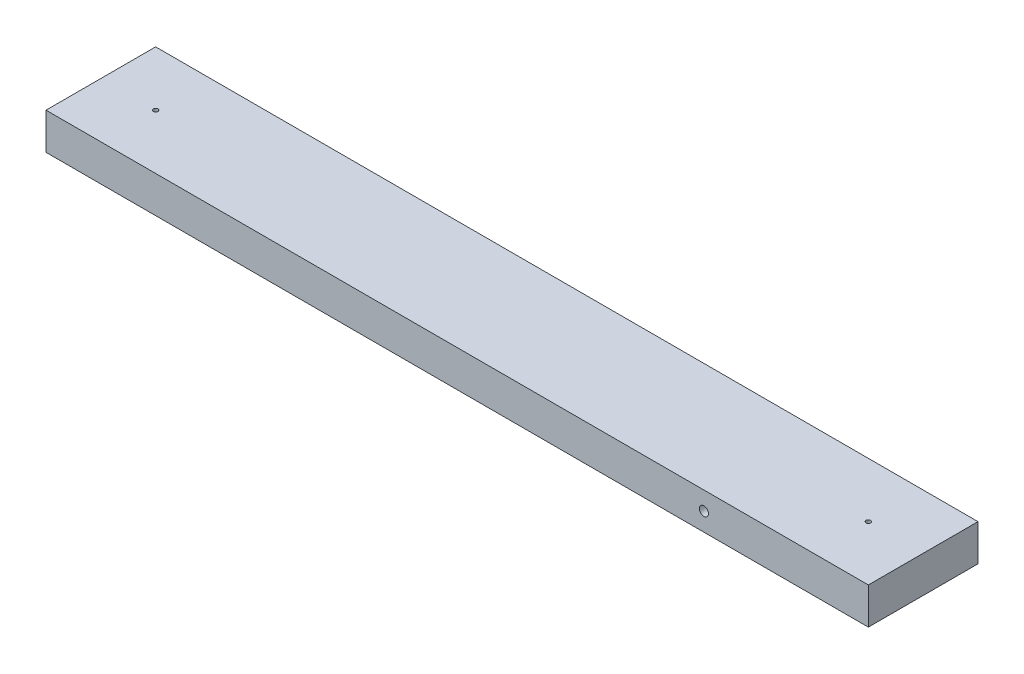
ISO-10303-21;
HEADER;
FILE_DESCRIPTION(('STEP AP214'),'2;1');
FILE_NAME('part.step','',(''),(''),'','','');
FILE_SCHEMA(('AUTOMOTIVE_DESIGN { 1 0 10303 214 1 1 1 1 }'));
ENDSEC;
DATA;
#1=APPLICATION_CONTEXT('core data for automotive mechanical design processes');
#2=APPLICATION_PROTOCOL_DEFINITION('international standard','automotive_design',2000,#1);
#3=PRODUCT_CONTEXT('',#1,'mechanical');
#4=PRODUCT('Part','Part','',(#3));
#5=PRODUCT_RELATED_PRODUCT_CATEGORY('part','',(#4));
#6=PRODUCT_DEFINITION_FORMATION('','',#4);
#7=PRODUCT_DEFINITION_CONTEXT('part definition',#1,'design');
#8=PRODUCT_DEFINITION('design','',#6,#7);
#9=PRODUCT_DEFINITION_SHAPE('','',#8);
#10=(LENGTH_UNIT() NAMED_UNIT(*) SI_UNIT(.MILLI.,.METRE.));
#11=(NAMED_UNIT(*) PLANE_ANGLE_UNIT() SI_UNIT($,.RADIAN.));
#12=(NAMED_UNIT(*) SI_UNIT($,.STERADIAN.) SOLID_ANGLE_UNIT());
#13=UNCERTAINTY_MEASURE_WITH_UNIT(LENGTH_MEASURE(1.E-05),#10,'distance_accuracy_value','');
#14=(GEOMETRIC_REPRESENTATION_CONTEXT(3) GLOBAL_UNCERTAINTY_ASSIGNED_CONTEXT((#13)) GLOBAL_UNIT_ASSIGNED_CONTEXT((#10,
#11,#12)) REPRESENTATION_CONTEXT('',''));
#15=CARTESIAN_POINT('',(0.,0.,0.));
#16=DIRECTION('',(0.,0.,1.));
#17=DIRECTION('',(1.,0.,0.));
#18=AXIS2_PLACEMENT_3D('',#15,#16,#17);
#19=CARTESIAN_POINT('',(2286.,50.8,-152.4));
#20=DIRECTION('',(0.,0.,1.));
#21=DIRECTION('',(1.,0.,0.));
#22=AXIS2_PLACEMENT_3D('',#19,#20,#21);
#23=PLANE('',#22);
#24=CARTESIAN_POINT('',(1828.8,0.,-152.4));
#25=DIRECTION('',(0.,0.,1.));
#26=DIRECTION('',(1.,0.,0.));
#27=AXIS2_PLACEMENT_3D('',#24,#25,#26);
#28=CIRCLE('',#27,12.6999999999999);
#29=CARTESIAN_POINT('',(1841.5,0.,-152.4));
#30=VERTEX_POINT('',#29);
#31=EDGE_CURVE('E104',#30,#30,#28,.F.);
#32=ORIENTED_EDGE('',*,*,#31,.F.);
#33=EDGE_LOOP('',(#32));
#34=FACE_BOUND('',#33,.T.);
#35=DIRECTION('',(0.,1.,0.));
#36=VECTOR('',#35,1.);
#37=CARTESIAN_POINT('',(0.,50.8,-152.4));
#38=LINE('',#37,#36);
#39=CARTESIAN_POINT('',(0.,-50.8,-152.4));
#40=VERTEX_POINT('',#39);
#41=CARTESIAN_POINT('',(0.,50.8,-152.4));
#42=VERTEX_POINT('',#41);
#43=EDGE_CURVE('E101',#40,#42,#38,.T.);
#44=ORIENTED_EDGE('',*,*,#43,.T.);
#45=DIRECTION('',(-1.,0.,0.));
#46=VECTOR('',#45,1.);
#47=CARTESIAN_POINT('',(2286.,50.8,-152.4));
#48=LINE('',#47,#46);
#49=CARTESIAN_POINT('',(2286.,50.8,-152.4));
#50=VERTEX_POINT('',#49);
#51=EDGE_CURVE('E11',#50,#42,#48,.T.);
#52=ORIENTED_EDGE('',*,*,#51,.F.);
#53=DIRECTION('',(0.,1.,0.));
#54=VECTOR('',#53,1.);
#55=CARTESIAN_POINT('',(2286.,50.8,-152.4));
#56=LINE('',#55,#54);
#57=CARTESIAN_POINT('',(2286.,-50.8,-152.4));
#58=VERTEX_POINT('',#57);
#59=EDGE_CURVE('E89',#58,#50,#56,.T.);
#60=ORIENTED_EDGE('',*,*,#59,.F.);
#61=DIRECTION('',(-1.,0.,0.));
#62=VECTOR('',#61,1.);
#63=CARTESIAN_POINT('',(2286.,-50.8,-152.4));
#64=LINE('',#63,#62);
#65=EDGE_CURVE('E97',#58,#40,#64,.T.);
#66=ORIENTED_EDGE('',*,*,#65,.T.);
#67=EDGE_LOOP('',(#44,#52,#60,#66));
#68=FACE_BOUND('',#67,.T.);
#69=ADVANCED_FACE('F38',(#34,#68),#23,.F.);
#70=CARTESIAN_POINT('',(2286.,50.8,152.4));
#71=DIRECTION('',(0.,-1.,0.));
#72=DIRECTION('',(0.,0.,-1.));
#73=AXIS2_PLACEMENT_3D('',#70,#71,#72);
#74=PLANE('',#73);
#75=CARTESIAN_POINT('',(152.4,50.8,0.));
#76=DIRECTION('',(0.,-1.,0.));
#77=DIRECTION('',(0.,0.,-1.));
#78=AXIS2_PLACEMENT_3D('',#75,#76,#77);
#79=CIRCLE('',#78,6.35);
#80=CARTESIAN_POINT('',(152.4,50.8,-6.35));
#81=VERTEX_POINT('',#80);
#82=EDGE_CURVE('E126',#81,#81,#79,.F.);
#83=ORIENTED_EDGE('',*,*,#82,.F.);
#84=EDGE_LOOP('',(#83));
#85=FACE_BOUND('',#84,.T.);
#86=CARTESIAN_POINT('',(2133.6,50.8,0.));
#87=DIRECTION('',(0.,1.,0.));
#88=DIRECTION('',(0.,0.,1.));
#89=AXIS2_PLACEMENT_3D('',#86,#87,#88);
#90=CIRCLE('',#89,6.34999999999972);
#91=CARTESIAN_POINT('',(2133.6,50.8,6.34999999999972));
#92=VERTEX_POINT('',#91);
#93=EDGE_CURVE('E123',#92,#92,#90,.T.);
#94=ORIENTED_EDGE('',*,*,#93,.F.);
#95=EDGE_LOOP('',(#94));
#96=FACE_BOUND('',#95,.T.);
#97=DIRECTION('',(0.,0.,1.));
#98=VECTOR('',#97,1.);
#99=CARTESIAN_POINT('',(0.,50.8,152.4));
#100=LINE('',#99,#98);
#101=CARTESIAN_POINT('',(0.,50.8,152.4));
#102=VERTEX_POINT('',#101);
#103=EDGE_CURVE('E93',#42,#102,#100,.T.);
#104=ORIENTED_EDGE('',*,*,#103,.T.);
#105=DIRECTION('',(-1.,0.,0.));
#106=VECTOR('',#105,1.);
#107=CARTESIAN_POINT('',(2286.,50.8,152.4));
#108=LINE('',#107,#106);
#109=CARTESIAN_POINT('',(2286.,50.8,152.4));
#110=VERTEX_POINT('',#109);
#111=EDGE_CURVE('E46',#110,#102,#108,.T.);
#112=ORIENTED_EDGE('',*,*,#111,.F.);
#113=DIRECTION('',(0.,0.,1.));
#114=VECTOR('',#113,1.);
#115=CARTESIAN_POINT('',(2286.,50.8,152.4));
#116=LINE('',#115,#114);
#117=EDGE_CURVE('E84',#50,#110,#116,.T.);
#118=ORIENTED_EDGE('',*,*,#117,.F.);
#119=ORIENTED_EDGE('',*,*,#51,.T.);
#120=EDGE_LOOP('',(#104,#112,#118,#119));
#121=FACE_BOUND('',#120,.T.);
#122=ADVANCED_FACE('F92',(#85,#96,#121),#74,.F.);
#123=CARTESIAN_POINT('',(2286.,50.8,152.4));
#124=DIRECTION('',(0.,0.,-1.));
#125=DIRECTION('',(-1.,0.,0.));
#126=AXIS2_PLACEMENT_3D('',#123,#124,#125);
#127=PLANE('',#126);
#128=CARTESIAN_POINT('',(1828.8,0.,152.4));
#129=DIRECTION('',(0.,0.,1.));
#130=DIRECTION('',(1.,0.,0.));
#131=AXIS2_PLACEMENT_3D('',#128,#129,#130);
#132=CIRCLE('',#131,12.6999999999999);
#133=CARTESIAN_POINT('',(1841.5,0.,152.4));
#134=VERTEX_POINT('',#133);
#135=EDGE_CURVE('E117',#134,#134,#132,.T.);
#136=ORIENTED_EDGE('',*,*,#135,.F.);
#137=EDGE_LOOP('',(#136));
#138=FACE_BOUND('',#137,.T.);
#139=DIRECTION('',(0.,-1.,0.));
#140=VECTOR('',#139,1.);
#141=CARTESIAN_POINT('',(0.,50.8,152.4));
#142=LINE('',#141,#140);
#143=CARTESIAN_POINT('',(0.,-50.8,152.4));
#144=VERTEX_POINT('',#143);
#145=EDGE_CURVE('E71',#102,#144,#142,.T.);
#146=ORIENTED_EDGE('',*,*,#145,.T.);
#147=DIRECTION('',(-1.,0.,0.));
#148=VECTOR('',#147,1.);
#149=CARTESIAN_POINT('',(2286.,-50.8,152.4));
#150=LINE('',#149,#148);
#151=CARTESIAN_POINT('',(2286.,-50.8,152.4));
#152=VERTEX_POINT('',#151);
#153=EDGE_CURVE('E94',#152,#144,#150,.T.);
#154=ORIENTED_EDGE('',*,*,#153,.F.);
#155=DIRECTION('',(0.,-1.,0.));
#156=VECTOR('',#155,1.);
#157=CARTESIAN_POINT('',(2286.,50.8,152.4));
#158=LINE('',#157,#156);
#159=EDGE_CURVE('E87',#110,#152,#158,.T.);
#160=ORIENTED_EDGE('',*,*,#159,.F.);
#161=ORIENTED_EDGE('',*,*,#111,.T.);
#162=EDGE_LOOP('',(#146,#154,#160,#161));
#163=FACE_BOUND('',#162,.T.);
#164=ADVANCED_FACE('F95',(#138,#163),#127,.F.);
#165=CARTESIAN_POINT('',(2286.,-50.8,152.4));
#166=DIRECTION('',(0.,1.,0.));
#167=DIRECTION('',(0.,0.,1.));
#168=AXIS2_PLACEMENT_3D('',#165,#166,#167);
#169=PLANE('',#168);
#170=CARTESIAN_POINT('',(152.4,-50.8,0.));
#171=DIRECTION('',(0.,-1.,0.));
#172=DIRECTION('',(0.,0.,-1.));
#173=AXIS2_PLACEMENT_3D('',#170,#171,#172);
#174=CIRCLE('',#173,6.35);
#175=CARTESIAN_POINT('',(152.4,-50.8,-6.35));
#176=VERTEX_POINT('',#175);
#177=EDGE_CURVE('E129',#176,#176,#174,.T.);
#178=ORIENTED_EDGE('',*,*,#177,.F.);
#179=EDGE_LOOP('',(#178));
#180=FACE_BOUND('',#179,.T.);
#181=CARTESIAN_POINT('',(2133.6,-50.8,0.));
#182=DIRECTION('',(0.,1.,0.));
#183=DIRECTION('',(0.,0.,1.));
#184=AXIS2_PLACEMENT_3D('',#181,#182,#183);
#185=CIRCLE('',#184,6.34999999999972);
#186=CARTESIAN_POINT('',(2133.6,-50.8,6.34999999999972));
#187=VERTEX_POINT('',#186);
#188=EDGE_CURVE('E120',#187,#187,#185,.F.);
#189=ORIENTED_EDGE('',*,*,#188,.F.);
#190=EDGE_LOOP('',(#189));
#191=FACE_BOUND('',#190,.T.);
#192=DIRECTION('',(0.,0.,-1.));
#193=VECTOR('',#192,1.);
#194=CARTESIAN_POINT('',(0.,-50.8,152.4));
#195=LINE('',#194,#193);
#196=EDGE_CURVE('E77',#144,#40,#195,.T.);
#197=ORIENTED_EDGE('',*,*,#196,.T.);
#198=ORIENTED_EDGE('',*,*,#65,.F.);
#199=DIRECTION('',(0.,0.,-1.));
#200=VECTOR('',#199,1.);
#201=CARTESIAN_POINT('',(2286.,-50.8,152.4));
#202=LINE('',#201,#200);
#203=EDGE_CURVE('E54',#152,#58,#202,.T.);
#204=ORIENTED_EDGE('',*,*,#203,.F.);
#205=ORIENTED_EDGE('',*,*,#153,.T.);
#206=EDGE_LOOP('',(#197,#198,#204,#205));
#207=FACE_BOUND('',#206,.T.);
#208=ADVANCED_FACE('F109',(#180,#191,#207),#169,.F.);
#209=CARTESIAN_POINT('',(2286.,0.,0.));
#210=DIRECTION('',(1.,0.,0.));
#211=DIRECTION('',(0.,0.,-1.));
#212=AXIS2_PLACEMENT_3D('',#209,#210,#211);
#213=PLANE('',#212);
#214=ORIENTED_EDGE('',*,*,#59,.T.);
#215=ORIENTED_EDGE('',*,*,#117,.T.);
#216=ORIENTED_EDGE('',*,*,#159,.T.);
#217=ORIENTED_EDGE('',*,*,#203,.T.);
#218=EDGE_LOOP('',(#214,#215,#216,#217));
#219=FACE_BOUND('',#218,.T.);
#220=ADVANCED_FACE('F85',(#219),#213,.T.);
#221=CARTESIAN_POINT('',(0.,0.,0.));
#222=DIRECTION('',(1.,0.,0.));
#223=DIRECTION('',(0.,0.,-1.));
#224=AXIS2_PLACEMENT_3D('',#221,#222,#223);
#225=PLANE('',#224);
#226=ORIENTED_EDGE('',*,*,#43,.F.);
#227=ORIENTED_EDGE('',*,*,#196,.F.);
#228=ORIENTED_EDGE('',*,*,#145,.F.);
#229=ORIENTED_EDGE('',*,*,#103,.F.);
#230=EDGE_LOOP('',(#226,#227,#228,#229));
#231=FACE_BOUND('',#230,.T.);
#232=ADVANCED_FACE('F112',(#231),#225,.F.);
#233=CARTESIAN_POINT('',(1828.8,0.,-188.321024484276));
#234=DIRECTION('',(0.,0.,1.));
#235=DIRECTION('',(1.,0.,0.));
#236=AXIS2_PLACEMENT_3D('',#233,#234,#235);
#237=CYLINDRICAL_SURFACE('',#236,12.6999999999999);
#238=ORIENTED_EDGE('',*,*,#31,.T.);
#239=EDGE_LOOP('',(#238));
#240=FACE_BOUND('',#239,.T.);
#241=ORIENTED_EDGE('',*,*,#135,.T.);
#242=EDGE_LOOP('',(#241));
#243=FACE_BOUND('',#242,.T.);
#244=ADVANCED_FACE('F143',(#240,#243),#237,.F.);
#245=CARTESIAN_POINT('',(2133.6,-68.7605122421377,0.));
#246=DIRECTION('',(0.,1.,0.));
#247=DIRECTION('',(0.,0.,1.));
#248=AXIS2_PLACEMENT_3D('',#245,#246,#247);
#249=CYLINDRICAL_SURFACE('',#248,6.34999999999972);
#250=ORIENTED_EDGE('',*,*,#188,.T.);
#251=EDGE_LOOP('',(#250));
#252=FACE_BOUND('',#251,.T.);
#253=ORIENTED_EDGE('',*,*,#93,.T.);
#254=EDGE_LOOP('',(#253));
#255=FACE_BOUND('',#254,.T.);
#256=ADVANCED_FACE('F140',(#252,#255),#249,.F.);
#257=CARTESIAN_POINT('',(152.4,68.7605122421383,0.));
#258=DIRECTION('',(0.,-1.,0.));
#259=DIRECTION('',(0.,0.,-1.));
#260=AXIS2_PLACEMENT_3D('',#257,#258,#259);
#261=CYLINDRICAL_SURFACE('',#260,6.35);
#262=ORIENTED_EDGE('',*,*,#82,.T.);
#263=EDGE_LOOP('',(#262));
#264=FACE_BOUND('',#263,.T.);
#265=ORIENTED_EDGE('',*,*,#177,.T.);
#266=EDGE_LOOP('',(#265));
#267=FACE_BOUND('',#266,.T.);
#268=ADVANCED_FACE('F133',(#264,#267),#261,.F.);
#269=CLOSED_SHELL('',(#69,#122,#164,#208,#220,#232,#244,#256,#268));
#270=MANIFOLD_SOLID_BREP('B2',#269);
#271=ADVANCED_BREP_SHAPE_REPRESENTATION('',(#18,#270),#14);
#272=SHAPE_DEFINITION_REPRESENTATION(#9,#271);
ENDSEC;
END-ISO-10303-21;
